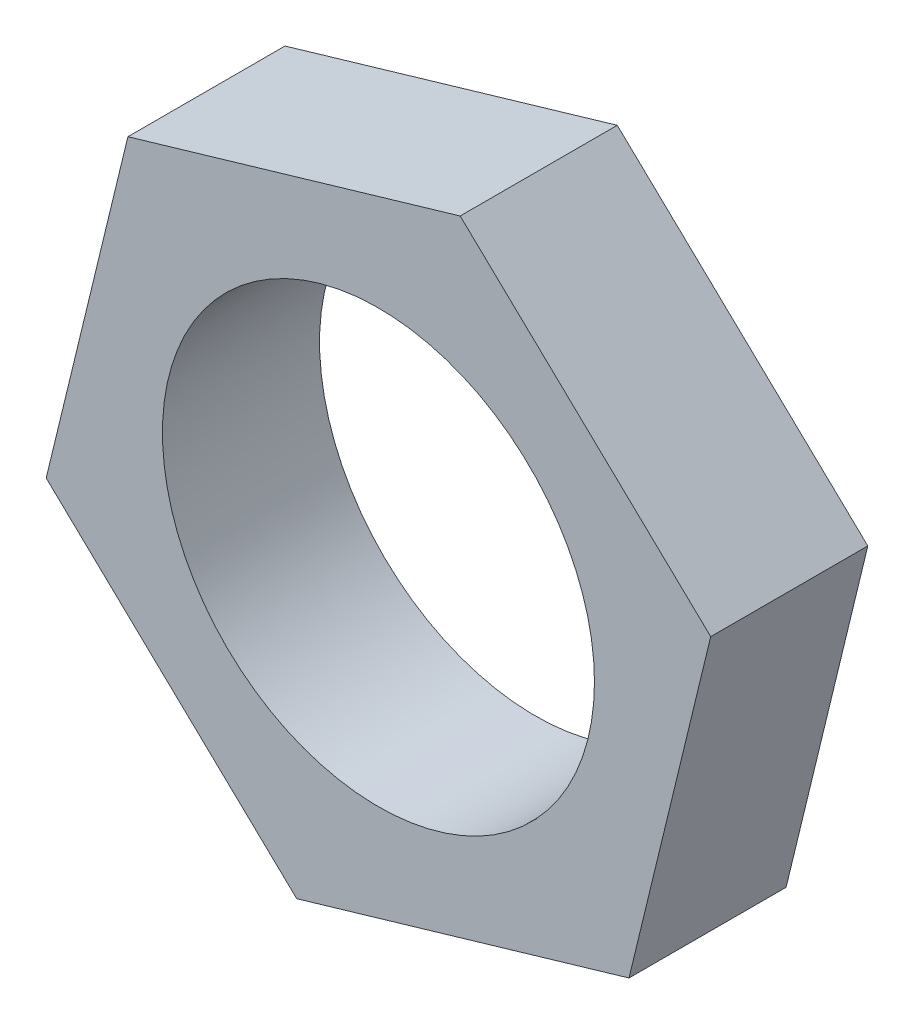
ISO-10303-21;
HEADER;
FILE_DESCRIPTION(('STEP AP214'),'2;1');
FILE_NAME('part.step','',(''),(''),'','','');
FILE_SCHEMA(('AUTOMOTIVE_DESIGN { 1 0 10303 214 1 1 1 1 }'));
ENDSEC;
DATA;
#1=APPLICATION_CONTEXT('core data for automotive mechanical design processes');
#2=APPLICATION_PROTOCOL_DEFINITION('international standard','automotive_design',2000,#1);
#3=PRODUCT_CONTEXT('',#1,'mechanical');
#4=PRODUCT('Part','Part','',(#3));
#5=PRODUCT_RELATED_PRODUCT_CATEGORY('part','',(#4));
#6=PRODUCT_DEFINITION_FORMATION('','',#4);
#7=PRODUCT_DEFINITION_CONTEXT('part definition',#1,'design');
#8=PRODUCT_DEFINITION('design','',#6,#7);
#9=PRODUCT_DEFINITION_SHAPE('','',#8);
#10=(LENGTH_UNIT() NAMED_UNIT(*) SI_UNIT(.MILLI.,.METRE.));
#11=(NAMED_UNIT(*) PLANE_ANGLE_UNIT() SI_UNIT($,.RADIAN.));
#12=(NAMED_UNIT(*) SI_UNIT($,.STERADIAN.) SOLID_ANGLE_UNIT());
#13=UNCERTAINTY_MEASURE_WITH_UNIT(LENGTH_MEASURE(1.E-05),#10,'distance_accuracy_value','');
#14=(GEOMETRIC_REPRESENTATION_CONTEXT(3) GLOBAL_UNCERTAINTY_ASSIGNED_CONTEXT((#13)) GLOBAL_UNIT_ASSIGNED_CONTEXT((#10,
#11,#12)) REPRESENTATION_CONTEXT('',''));
#15=CARTESIAN_POINT('',(0.,0.,0.));
#16=DIRECTION('',(0.,0.,1.));
#17=DIRECTION('',(1.,0.,0.));
#18=AXIS2_PLACEMENT_3D('',#15,#16,#17);
#19=CARTESIAN_POINT('',(8.46022821399629,2.48187177304345,-4.));
#20=DIRECTION('',(0.690258200851695,0.723563139025878,0.));
#21=DIRECTION('',(-0.723563139025878,0.690258200851695,0.));
#22=AXIS2_PLACEMENT_3D('',#19,#20,#21);
#23=PLANE('',#22);
#24=DIRECTION('',(-0.723563139025877,0.690258200851695,0.));
#25=VECTOR('',#24,1.);
#26=CARTESIAN_POINT('',(8.46022821399629,2.48187177304345,0.));
#27=LINE('',#26,#25);
#28=CARTESIAN_POINT('',(8.46022821399629,2.48187177304345,0.));
#29=VERTEX_POINT('',#28);
#30=CARTESIAN_POINT('',(2.08075010260699,8.56770844165636,0.));
#31=VERTEX_POINT('',#30);
#32=EDGE_CURVE('E117',#29,#31,#27,.T.);
#33=ORIENTED_EDGE('',*,*,#32,.F.);
#34=DIRECTION('',(0.,0.,1.));
#35=VECTOR('',#34,1.);
#36=CARTESIAN_POINT('',(8.46022821399629,2.48187177304345,-4.));
#37=LINE('',#36,#35);
#38=CARTESIAN_POINT('',(8.46022821399629,2.48187177304345,-4.));
#39=VERTEX_POINT('',#38);
#40=EDGE_CURVE('E11',#39,#29,#37,.T.);
#41=ORIENTED_EDGE('',*,*,#40,.F.);
#42=DIRECTION('',(-0.723563139025877,0.690258200851695,0.));
#43=VECTOR('',#42,1.);
#44=CARTESIAN_POINT('',(8.46022821399629,2.48187177304345,-4.));
#45=LINE('',#44,#43);
#46=CARTESIAN_POINT('',(2.08075010260699,8.56770844165636,-4.));
#47=VERTEX_POINT('',#46);
#48=EDGE_CURVE('E132',#39,#47,#45,.T.);
#49=ORIENTED_EDGE('',*,*,#48,.T.);
#50=DIRECTION('',(0.,0.,1.));
#51=VECTOR('',#50,1.);
#52=CARTESIAN_POINT('',(2.08075010260699,8.56770844165636,-4.));
#53=LINE('',#52,#51);
#54=EDGE_CURVE('E35',#47,#31,#53,.T.);
#55=ORIENTED_EDGE('',*,*,#54,.T.);
#56=EDGE_LOOP('',(#33,#41,#49,#55));
#57=FACE_BOUND('',#56,.T.);
#58=ADVANCED_FACE('F32',(#57),#23,.T.);
#59=CARTESIAN_POINT('',(6.3794781113893,-6.08583666861292,-4.));
#60=DIRECTION('',(0.971753160064269,-0.23599956759517,0.));
#61=DIRECTION('',(0.23599956759517,0.971753160064269,0.));
#62=AXIS2_PLACEMENT_3D('',#59,#60,#61);
#63=PLANE('',#62);
#64=DIRECTION('',(0.23599956759517,0.971753160064269,0.));
#65=VECTOR('',#64,1.);
#66=CARTESIAN_POINT('',(6.3794781113893,-6.08583666861292,0.));
#67=LINE('',#66,#65);
#68=CARTESIAN_POINT('',(6.3794781113893,-6.08583666861292,0.));
#69=VERTEX_POINT('',#68);
#70=EDGE_CURVE('E130',#69,#29,#67,.T.);
#71=ORIENTED_EDGE('',*,*,#70,.F.);
#72=DIRECTION('',(0.,0.,1.));
#73=VECTOR('',#72,1.);
#74=CARTESIAN_POINT('',(6.3794781113893,-6.08583666861292,-4.));
#75=LINE('',#74,#73);
#76=CARTESIAN_POINT('',(6.3794781113893,-6.08583666861292,-4.));
#77=VERTEX_POINT('',#76);
#78=EDGE_CURVE('E41',#77,#69,#75,.T.);
#79=ORIENTED_EDGE('',*,*,#78,.F.);
#80=DIRECTION('',(0.23599956759517,0.971753160064269,0.));
#81=VECTOR('',#80,1.);
#82=CARTESIAN_POINT('',(6.3794781113893,-6.08583666861292,-4.));
#83=LINE('',#82,#81);
#84=EDGE_CURVE('E107',#77,#39,#83,.T.);
#85=ORIENTED_EDGE('',*,*,#84,.T.);
#86=ORIENTED_EDGE('',*,*,#40,.T.);
#87=EDGE_LOOP('',(#71,#79,#85,#86));
#88=FACE_BOUND('',#87,.T.);
#89=ADVANCED_FACE('F140',(#88),#63,.T.);
#90=CARTESIAN_POINT('',(-2.08075010260699,-8.56770844165636,-4.));
#91=DIRECTION('',(0.281494959212574,-0.959562706621048,0.));
#92=DIRECTION('',(0.959562706621048,0.281494959212574,0.));
#93=AXIS2_PLACEMENT_3D('',#90,#91,#92);
#94=PLANE('',#93);
#95=DIRECTION('',(0.959562706621048,0.281494959212574,0.));
#96=VECTOR('',#95,1.);
#97=CARTESIAN_POINT('',(-2.08075010260699,-8.56770844165636,0.));
#98=LINE('',#97,#96);
#99=CARTESIAN_POINT('',(-2.08075010260699,-8.56770844165636,0.));
#100=VERTEX_POINT('',#99);
#101=EDGE_CURVE('E94',#100,#69,#98,.T.);
#102=ORIENTED_EDGE('',*,*,#101,.F.);
#103=DIRECTION('',(0.,0.,1.));
#104=VECTOR('',#103,1.);
#105=CARTESIAN_POINT('',(-2.08075010260699,-8.56770844165636,-4.));
#106=LINE('',#105,#104);
#107=CARTESIAN_POINT('',(-2.08075010260699,-8.56770844165636,-4.));
#108=VERTEX_POINT('',#107);
#109=EDGE_CURVE('E89',#108,#100,#106,.T.);
#110=ORIENTED_EDGE('',*,*,#109,.F.);
#111=DIRECTION('',(0.959562706621048,0.281494959212574,0.));
#112=VECTOR('',#111,1.);
#113=CARTESIAN_POINT('',(-2.08075010260699,-8.56770844165636,-4.));
#114=LINE('',#113,#112);
#115=EDGE_CURVE('E92',#108,#77,#114,.T.);
#116=ORIENTED_EDGE('',*,*,#115,.T.);
#117=ORIENTED_EDGE('',*,*,#78,.T.);
#118=EDGE_LOOP('',(#102,#110,#116,#117));
#119=FACE_BOUND('',#118,.T.);
#120=ADVANCED_FACE('F91',(#119),#94,.T.);
#121=CARTESIAN_POINT('',(-8.46022821399629,-2.48187177304345,-4.));
#122=DIRECTION('',(-0.690258200851695,-0.723563139025877,0.));
#123=DIRECTION('',(0.723563139025877,-0.690258200851695,0.));
#124=AXIS2_PLACEMENT_3D('',#121,#122,#123);
#125=PLANE('',#124);
#126=DIRECTION('',(0.723563139025877,-0.690258200851695,0.));
#127=VECTOR('',#126,1.);
#128=CARTESIAN_POINT('',(-8.46022821399629,-2.48187177304345,0.));
#129=LINE('',#128,#127);
#130=CARTESIAN_POINT('',(-8.46022821399629,-2.48187177304345,0.));
#131=VERTEX_POINT('',#130);
#132=EDGE_CURVE('E127',#131,#100,#129,.T.);
#133=ORIENTED_EDGE('',*,*,#132,.F.);
#134=DIRECTION('',(0.,0.,1.));
#135=VECTOR('',#134,1.);
#136=CARTESIAN_POINT('',(-8.46022821399629,-2.48187177304345,-4.));
#137=LINE('',#136,#135);
#138=CARTESIAN_POINT('',(-8.46022821399629,-2.48187177304345,-4.));
#139=VERTEX_POINT('',#138);
#140=EDGE_CURVE('E99',#139,#131,#137,.T.);
#141=ORIENTED_EDGE('',*,*,#140,.F.);
#142=DIRECTION('',(0.723563139025877,-0.690258200851695,0.));
#143=VECTOR('',#142,1.);
#144=CARTESIAN_POINT('',(-8.46022821399629,-2.48187177304345,-4.));
#145=LINE('',#144,#143);
#146=EDGE_CURVE('E105',#139,#108,#145,.T.);
#147=ORIENTED_EDGE('',*,*,#146,.T.);
#148=ORIENTED_EDGE('',*,*,#109,.T.);
#149=EDGE_LOOP('',(#133,#141,#147,#148));
#150=FACE_BOUND('',#149,.T.);
#151=ADVANCED_FACE('F109',(#150),#125,.T.);
#152=CARTESIAN_POINT('',(-6.3794781113893,6.08583666861291,-4.));
#153=DIRECTION('',(-0.971753160064269,0.235999567595171,0.));
#154=DIRECTION('',(-0.235999567595171,-0.971753160064269,0.));
#155=AXIS2_PLACEMENT_3D('',#152,#153,#154);
#156=PLANE('',#155);
#157=DIRECTION('',(-0.235999567595171,-0.971753160064269,0.));
#158=VECTOR('',#157,1.);
#159=CARTESIAN_POINT('',(-6.3794781113893,6.08583666861291,0.));
#160=LINE('',#159,#158);
#161=CARTESIAN_POINT('',(-6.3794781113893,6.08583666861291,0.));
#162=VERTEX_POINT('',#161);
#163=EDGE_CURVE('E124',#162,#131,#160,.T.);
#164=ORIENTED_EDGE('',*,*,#163,.F.);
#165=DIRECTION('',(0.,0.,1.));
#166=VECTOR('',#165,1.);
#167=CARTESIAN_POINT('',(-6.3794781113893,6.08583666861291,-4.));
#168=LINE('',#167,#166);
#169=CARTESIAN_POINT('',(-6.3794781113893,6.08583666861291,-4.));
#170=VERTEX_POINT('',#169);
#171=EDGE_CURVE('E135',#170,#162,#168,.T.);
#172=ORIENTED_EDGE('',*,*,#171,.F.);
#173=DIRECTION('',(-0.235999567595171,-0.971753160064269,0.));
#174=VECTOR('',#173,1.);
#175=CARTESIAN_POINT('',(-6.3794781113893,6.08583666861291,-4.));
#176=LINE('',#175,#174);
#177=EDGE_CURVE('E110',#170,#139,#176,.T.);
#178=ORIENTED_EDGE('',*,*,#177,.T.);
#179=ORIENTED_EDGE('',*,*,#140,.T.);
#180=EDGE_LOOP('',(#164,#172,#178,#179));
#181=FACE_BOUND('',#180,.T.);
#182=ADVANCED_FACE('F153',(#181),#156,.T.);
#183=CARTESIAN_POINT('',(2.08075010260699,8.56770844165636,-4.));
#184=DIRECTION('',(-0.281494959212574,0.959562706621048,0.));
#185=DIRECTION('',(-0.959562706621048,-0.281494959212574,0.));
#186=AXIS2_PLACEMENT_3D('',#183,#184,#185);
#187=PLANE('',#186);
#188=DIRECTION('',(-0.959562706621048,-0.281494959212574,0.));
#189=VECTOR('',#188,1.);
#190=CARTESIAN_POINT('',(2.08075010260699,8.56770844165636,0.));
#191=LINE('',#190,#189);
#192=EDGE_CURVE('E120',#31,#162,#191,.T.);
#193=ORIENTED_EDGE('',*,*,#192,.F.);
#194=ORIENTED_EDGE('',*,*,#54,.F.);
#195=DIRECTION('',(-0.959562706621048,-0.281494959212574,0.));
#196=VECTOR('',#195,1.);
#197=CARTESIAN_POINT('',(2.08075010260699,8.56770844165636,-4.));
#198=LINE('',#197,#196);
#199=EDGE_CURVE('E112',#47,#170,#198,.T.);
#200=ORIENTED_EDGE('',*,*,#199,.T.);
#201=ORIENTED_EDGE('',*,*,#171,.T.);
#202=EDGE_LOOP('',(#193,#194,#200,#201));
#203=FACE_BOUND('',#202,.T.);
#204=ADVANCED_FACE('F137',(#203),#187,.T.);
#205=CARTESIAN_POINT('',(0.,0.,-4.));
#206=DIRECTION('',(0.,0.,1.));
#207=DIRECTION('',(1.,0.,0.));
#208=AXIS2_PLACEMENT_3D('',#205,#206,#207);
#209=PLANE('',#208);
#210=CARTESIAN_POINT('',(0.,0.,-4.));
#211=DIRECTION('',(0.,0.,1.));
#212=DIRECTION('',(1.,0.,0.));
#213=AXIS2_PLACEMENT_3D('',#210,#211,#212);
#214=CIRCLE('',#213,5.5);
#215=CARTESIAN_POINT('',(5.5,0.,-4.));
#216=VERTEX_POINT('',#215);
#217=EDGE_CURVE('E121',#216,#216,#214,.T.);
#218=ORIENTED_EDGE('',*,*,#217,.T.);
#219=EDGE_LOOP('',(#218));
#220=FACE_BOUND('',#219,.T.);
#221=ORIENTED_EDGE('',*,*,#48,.F.);
#222=ORIENTED_EDGE('',*,*,#84,.F.);
#223=ORIENTED_EDGE('',*,*,#115,.F.);
#224=ORIENTED_EDGE('',*,*,#146,.F.);
#225=ORIENTED_EDGE('',*,*,#177,.F.);
#226=ORIENTED_EDGE('',*,*,#199,.F.);
#227=EDGE_LOOP('',(#221,#222,#223,#224,#225,#226));
#228=FACE_BOUND('',#227,.T.);
#229=ADVANCED_FACE('F103',(#220,#228),#209,.F.);
#230=CARTESIAN_POINT('',(0.,0.,0.));
#231=DIRECTION('',(0.,0.,1.));
#232=DIRECTION('',(1.,0.,0.));
#233=AXIS2_PLACEMENT_3D('',#230,#231,#232);
#234=PLANE('',#233);
#235=CARTESIAN_POINT('',(0.,0.,0.));
#236=DIRECTION('',(0.,0.,1.));
#237=DIRECTION('',(1.,0.,0.));
#238=AXIS2_PLACEMENT_3D('',#235,#236,#237);
#239=CIRCLE('',#238,5.5);
#240=CARTESIAN_POINT('',(5.5,0.,0.));
#241=VERTEX_POINT('',#240);
#242=EDGE_CURVE('E176',#241,#241,#239,.T.);
#243=ORIENTED_EDGE('',*,*,#242,.F.);
#244=EDGE_LOOP('',(#243));
#245=FACE_BOUND('',#244,.T.);
#246=ORIENTED_EDGE('',*,*,#32,.T.);
#247=ORIENTED_EDGE('',*,*,#192,.T.);
#248=ORIENTED_EDGE('',*,*,#163,.T.);
#249=ORIENTED_EDGE('',*,*,#132,.T.);
#250=ORIENTED_EDGE('',*,*,#101,.T.);
#251=ORIENTED_EDGE('',*,*,#70,.T.);
#252=EDGE_LOOP('',(#246,#247,#248,#249,#250,#251));
#253=FACE_BOUND('',#252,.T.);
#254=ADVANCED_FACE('F139',(#245,#253),#234,.T.);
#255=CARTESIAN_POINT('',(0.,0.,-4.));
#256=DIRECTION('',(0.,0.,1.));
#257=DIRECTION('',(1.,0.,0.));
#258=AXIS2_PLACEMENT_3D('',#255,#256,#257);
#259=CYLINDRICAL_SURFACE('',#258,5.5);
#260=ORIENTED_EDGE('',*,*,#217,.F.);
#261=EDGE_LOOP('',(#260));
#262=FACE_BOUND('',#261,.T.);
#263=ORIENTED_EDGE('',*,*,#242,.T.);
#264=EDGE_LOOP('',(#263));
#265=FACE_BOUND('',#264,.T.);
#266=ADVANCED_FACE('F164',(#262,#265),#259,.F.);
#267=CLOSED_SHELL('',(#58,#89,#120,#151,#182,#204,#229,#254,#266));
#268=MANIFOLD_SOLID_BREP('B2',#267);
#269=ADVANCED_BREP_SHAPE_REPRESENTATION('',(#18,#268),#14);
#270=SHAPE_DEFINITION_REPRESENTATION(#9,#269);
ENDSEC;
END-ISO-10303-21;
